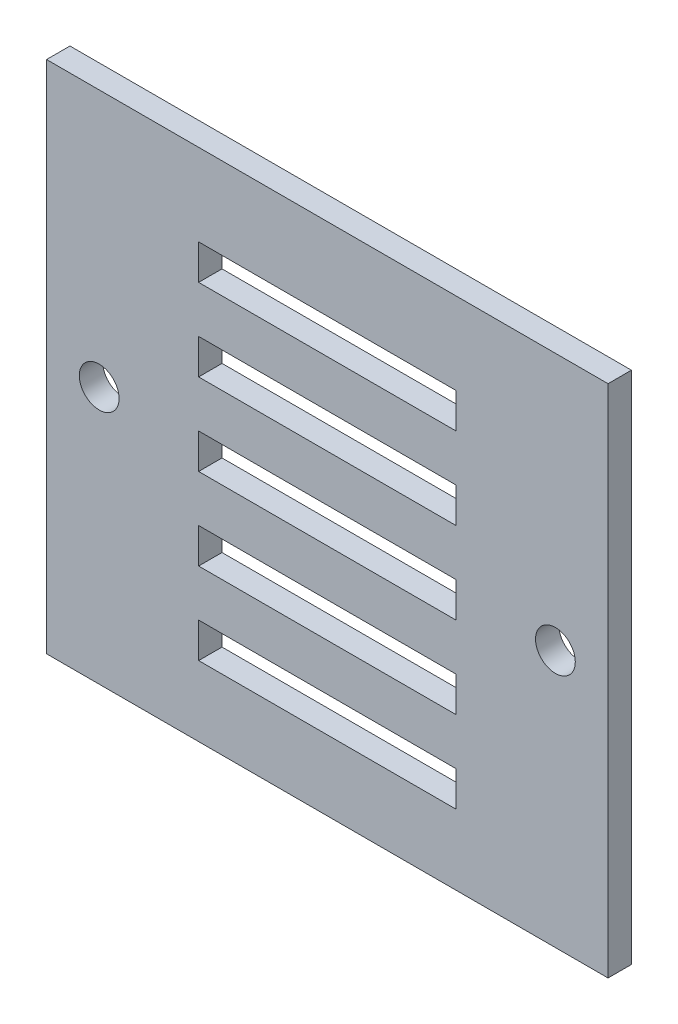
ISO-10303-21;
HEADER;
FILE_DESCRIPTION(('STEP AP214'),'2;1');
FILE_NAME('part.step','',(''),(''),'','','');
FILE_SCHEMA(('AUTOMOTIVE_DESIGN { 1 0 10303 214 1 1 1 1 }'));
ENDSEC;
DATA;
#1=APPLICATION_CONTEXT('core data for automotive mechanical design processes');
#2=APPLICATION_PROTOCOL_DEFINITION('international standard','automotive_design',2000,#1);
#3=PRODUCT_CONTEXT('',#1,'mechanical');
#4=PRODUCT('Part','Part','',(#3));
#5=PRODUCT_RELATED_PRODUCT_CATEGORY('part','',(#4));
#6=PRODUCT_DEFINITION_FORMATION('','',#4);
#7=PRODUCT_DEFINITION_CONTEXT('part definition',#1,'design');
#8=PRODUCT_DEFINITION('design','',#6,#7);
#9=PRODUCT_DEFINITION_SHAPE('','',#8);
#10=(LENGTH_UNIT() NAMED_UNIT(*) SI_UNIT(.MILLI.,.METRE.));
#11=(NAMED_UNIT(*) PLANE_ANGLE_UNIT() SI_UNIT($,.RADIAN.));
#12=(NAMED_UNIT(*) SI_UNIT($,.STERADIAN.) SOLID_ANGLE_UNIT());
#13=UNCERTAINTY_MEASURE_WITH_UNIT(LENGTH_MEASURE(1.E-05),#10,'distance_accuracy_value','');
#14=(GEOMETRIC_REPRESENTATION_CONTEXT(3) GLOBAL_UNCERTAINTY_ASSIGNED_CONTEXT((#13)) GLOBAL_UNIT_ASSIGNED_CONTEXT((#10,
#11,#12)) REPRESENTATION_CONTEXT('',''));
#15=CARTESIAN_POINT('',(0.,0.,0.));
#16=DIRECTION('',(0.,0.,1.));
#17=DIRECTION('',(1.,0.,0.));
#18=AXIS2_PLACEMENT_3D('',#15,#16,#17);
#19=CARTESIAN_POINT('',(-158.5,46.,414.9));
#20=DIRECTION('',(0.,0.,1.));
#21=DIRECTION('',(1.,0.,0.));
#22=AXIS2_PLACEMENT_3D('',#19,#20,#21);
#23=CYLINDRICAL_SURFACE('',#22,1.7);
#24=DIRECTION('',(0.,0.,1.));
#25=VECTOR('',#24,1.);
#26=CARTESIAN_POINT('',(-156.8,46.,414.9));
#27=LINE('',#26,#25);
#28=CARTESIAN_POINT('',(-156.8,46.,415.));
#29=VERTEX_POINT('',#28);
#30=CARTESIAN_POINT('',(-156.8,46.,417.));
#31=VERTEX_POINT('',#30);
#32=EDGE_CURVE('E9',#29,#31,#27,.T.);
#33=ORIENTED_EDGE('',*,*,#32,.F.);
#34=CARTESIAN_POINT('',(-158.5,46.,415.));
#35=DIRECTION('',(0.,0.,1.));
#36=DIRECTION('',(1.,0.,0.));
#37=AXIS2_PLACEMENT_3D('',#34,#35,#36);
#38=CIRCLE('',#37,1.7);
#39=EDGE_CURVE('E228',#29,#29,#38,.T.);
#40=ORIENTED_EDGE('',*,*,#39,.F.);
#41=ORIENTED_EDGE('',*,*,#32,.T.);
#42=CARTESIAN_POINT('',(-158.5,46.,417.));
#43=DIRECTION('',(0.,0.,1.));
#44=DIRECTION('',(1.,0.,0.));
#45=AXIS2_PLACEMENT_3D('',#42,#43,#44);
#46=CIRCLE('',#45,1.7);
#47=EDGE_CURVE('E290',#31,#31,#46,.T.);
#48=ORIENTED_EDGE('',*,*,#47,.T.);
#49=EDGE_LOOP('',(#33,#40,#41,#48));
#50=FACE_BOUND('',#49,.T.);
#51=ADVANCED_FACE('F14',(#50),#23,.F.);
#52=CARTESIAN_POINT('',(-189.,61.,414.9));
#53=DIRECTION('',(0.,1.,0.));
#54=DIRECTION('',(1.,0.,0.));
#55=AXIS2_PLACEMENT_3D('',#52,#53,#54);
#56=PLANE('',#55);
#57=DIRECTION('',(-1.,0.,0.));
#58=VECTOR('',#57,1.);
#59=CARTESIAN_POINT('',(-195.5,61.,417.));
#60=LINE('',#59,#58);
#61=CARTESIAN_POINT('',(-167.,61.,417.));
#62=VERTEX_POINT('',#61);
#63=CARTESIAN_POINT('',(-189.,61.,417.));
#64=VERTEX_POINT('',#63);
#65=EDGE_CURVE('E356',#62,#64,#60,.T.);
#66=ORIENTED_EDGE('',*,*,#65,.T.);
#67=DIRECTION('',(0.,0.,1.));
#68=VECTOR('',#67,1.);
#69=CARTESIAN_POINT('',(-189.,61.,414.9));
#70=LINE('',#69,#68);
#71=CARTESIAN_POINT('',(-189.,61.,415.));
#72=VERTEX_POINT('',#71);
#73=EDGE_CURVE('E25',#72,#64,#70,.T.);
#74=ORIENTED_EDGE('',*,*,#73,.F.);
#75=DIRECTION('',(-1.,0.,0.));
#76=VECTOR('',#75,1.);
#77=CARTESIAN_POINT('',(-195.5,61.,415.));
#78=LINE('',#77,#76);
#79=CARTESIAN_POINT('',(-167.,61.,415.));
#80=VERTEX_POINT('',#79);
#81=EDGE_CURVE('E234',#80,#72,#78,.T.);
#82=ORIENTED_EDGE('',*,*,#81,.F.);
#83=DIRECTION('',(0.,0.,1.));
#84=VECTOR('',#83,1.);
#85=CARTESIAN_POINT('',(-167.,61.,414.9));
#86=LINE('',#85,#84);
#87=EDGE_CURVE('E231',#80,#62,#86,.T.);
#88=ORIENTED_EDGE('',*,*,#87,.T.);
#89=EDGE_LOOP('',(#66,#74,#82,#88));
#90=FACE_BOUND('',#89,.T.);
#91=ADVANCED_FACE('F765',(#90),#56,.F.);
#92=CARTESIAN_POINT('',(-189.,58.,414.9));
#93=DIRECTION('',(1.,0.,0.));
#94=DIRECTION('',(0.,1.,0.));
#95=AXIS2_PLACEMENT_3D('',#92,#93,#94);
#96=PLANE('',#95);
#97=DIRECTION('',(0.,0.,1.));
#98=VECTOR('',#97,1.);
#99=CARTESIAN_POINT('',(-189.,58.,414.9));
#100=LINE('',#99,#98);
#101=CARTESIAN_POINT('',(-189.,58.,415.));
#102=VERTEX_POINT('',#101);
#103=CARTESIAN_POINT('',(-189.,58.,417.));
#104=VERTEX_POINT('',#103);
#105=EDGE_CURVE('E217',#102,#104,#100,.T.);
#106=ORIENTED_EDGE('',*,*,#105,.F.);
#107=DIRECTION('',(0.,1.,0.));
#108=VECTOR('',#107,1.);
#109=CARTESIAN_POINT('',(-189.,41.,415.));
#110=LINE('',#109,#108);
#111=EDGE_CURVE('E226',#102,#72,#110,.T.);
#112=ORIENTED_EDGE('',*,*,#111,.T.);
#113=ORIENTED_EDGE('',*,*,#73,.T.);
#114=DIRECTION('',(0.,1.,0.));
#115=VECTOR('',#114,1.);
#116=CARTESIAN_POINT('',(-189.,41.,417.));
#117=LINE('',#116,#115);
#118=EDGE_CURVE('E360',#104,#64,#117,.T.);
#119=ORIENTED_EDGE('',*,*,#118,.F.);
#120=EDGE_LOOP('',(#106,#112,#113,#119));
#121=FACE_BOUND('',#120,.T.);
#122=ADVANCED_FACE('F749',(#121),#96,.T.);
#123=CARTESIAN_POINT('',(-167.,58.,414.9));
#124=DIRECTION('',(1.,0.,0.));
#125=DIRECTION('',(0.,1.,0.));
#126=AXIS2_PLACEMENT_3D('',#123,#124,#125);
#127=PLANE('',#126);
#128=DIRECTION('',(0.,1.,0.));
#129=VECTOR('',#128,1.);
#130=CARTESIAN_POINT('',(-167.,41.,417.));
#131=LINE('',#130,#129);
#132=CARTESIAN_POINT('',(-167.,58.,417.));
#133=VERTEX_POINT('',#132);
#134=EDGE_CURVE('E294',#133,#62,#131,.T.);
#135=ORIENTED_EDGE('',*,*,#134,.T.);
#136=ORIENTED_EDGE('',*,*,#87,.F.);
#137=DIRECTION('',(0.,1.,0.));
#138=VECTOR('',#137,1.);
#139=CARTESIAN_POINT('',(-167.,41.,415.));
#140=LINE('',#139,#138);
#141=CARTESIAN_POINT('',(-167.,58.,415.));
#142=VERTEX_POINT('',#141);
#143=EDGE_CURVE('E224',#142,#80,#140,.T.);
#144=ORIENTED_EDGE('',*,*,#143,.F.);
#145=DIRECTION('',(0.,0.,1.));
#146=VECTOR('',#145,1.);
#147=CARTESIAN_POINT('',(-167.,58.,414.9));
#148=LINE('',#147,#146);
#149=EDGE_CURVE('E205',#142,#133,#148,.T.);
#150=ORIENTED_EDGE('',*,*,#149,.T.);
#151=EDGE_LOOP('',(#135,#136,#144,#150));
#152=FACE_BOUND('',#151,.T.);
#153=ADVANCED_FACE('F230',(#152),#127,.F.);
#154=CARTESIAN_POINT('',(-189.,58.,414.9));
#155=DIRECTION('',(0.,1.,0.));
#156=DIRECTION('',(1.,0.,0.));
#157=AXIS2_PLACEMENT_3D('',#154,#155,#156);
#158=PLANE('',#157);
#159=ORIENTED_EDGE('',*,*,#149,.F.);
#160=DIRECTION('',(-1.,0.,0.));
#161=VECTOR('',#160,1.);
#162=CARTESIAN_POINT('',(-195.5,58.,415.));
#163=LINE('',#162,#161);
#164=EDGE_CURVE('E208',#142,#102,#163,.T.);
#165=ORIENTED_EDGE('',*,*,#164,.T.);
#166=ORIENTED_EDGE('',*,*,#105,.T.);
#167=DIRECTION('',(-1.,0.,0.));
#168=VECTOR('',#167,1.);
#169=CARTESIAN_POINT('',(-195.5,58.,417.));
#170=LINE('',#169,#168);
#171=EDGE_CURVE('E211',#133,#104,#170,.T.);
#172=ORIENTED_EDGE('',*,*,#171,.F.);
#173=EDGE_LOOP('',(#159,#165,#166,#172));
#174=FACE_BOUND('',#173,.T.);
#175=ADVANCED_FACE('F207',(#174),#158,.T.);
#176=CARTESIAN_POINT('',(-189.,54.,414.9));
#177=DIRECTION('',(0.,1.,0.));
#178=DIRECTION('',(1.,0.,0.));
#179=AXIS2_PLACEMENT_3D('',#176,#177,#178);
#180=PLANE('',#179);
#181=DIRECTION('',(-1.,0.,0.));
#182=VECTOR('',#181,1.);
#183=CARTESIAN_POINT('',(-195.5,54.,417.));
#184=LINE('',#183,#182);
#185=CARTESIAN_POINT('',(-167.,54.,417.));
#186=VERTEX_POINT('',#185);
#187=CARTESIAN_POINT('',(-189.,54.,417.));
#188=VERTEX_POINT('',#187);
#189=EDGE_CURVE('E273',#186,#188,#184,.T.);
#190=ORIENTED_EDGE('',*,*,#189,.T.);
#191=DIRECTION('',(0.,0.,1.));
#192=VECTOR('',#191,1.);
#193=CARTESIAN_POINT('',(-189.,54.,414.9));
#194=LINE('',#193,#192);
#195=CARTESIAN_POINT('',(-189.,54.,415.));
#196=VERTEX_POINT('',#195);
#197=EDGE_CURVE('E218',#196,#188,#194,.T.);
#198=ORIENTED_EDGE('',*,*,#197,.F.);
#199=DIRECTION('',(-1.,0.,0.));
#200=VECTOR('',#199,1.);
#201=CARTESIAN_POINT('',(-195.5,54.,415.));
#202=LINE('',#201,#200);
#203=CARTESIAN_POINT('',(-167.,54.,415.));
#204=VERTEX_POINT('',#203);
#205=EDGE_CURVE('E257',#204,#196,#202,.T.);
#206=ORIENTED_EDGE('',*,*,#205,.F.);
#207=DIRECTION('',(0.,0.,1.));
#208=VECTOR('',#207,1.);
#209=CARTESIAN_POINT('',(-167.,54.,414.9));
#210=LINE('',#209,#208);
#211=EDGE_CURVE('E345',#204,#186,#210,.T.);
#212=ORIENTED_EDGE('',*,*,#211,.T.);
#213=EDGE_LOOP('',(#190,#198,#206,#212));
#214=FACE_BOUND('',#213,.T.);
#215=ADVANCED_FACE('F665',(#214),#180,.F.);
#216=CARTESIAN_POINT('',(-189.,51.,414.9));
#217=DIRECTION('',(1.,0.,0.));
#218=DIRECTION('',(0.,1.,0.));
#219=AXIS2_PLACEMENT_3D('',#216,#217,#218);
#220=PLANE('',#219);
#221=DIRECTION('',(0.,0.,1.));
#222=VECTOR('',#221,1.);
#223=CARTESIAN_POINT('',(-189.,51.,414.9));
#224=LINE('',#223,#222);
#225=CARTESIAN_POINT('',(-189.,51.,415.));
#226=VERTEX_POINT('',#225);
#227=CARTESIAN_POINT('',(-189.,51.,417.));
#228=VERTEX_POINT('',#227);
#229=EDGE_CURVE('E348',#226,#228,#224,.T.);
#230=ORIENTED_EDGE('',*,*,#229,.F.);
#231=DIRECTION('',(0.,1.,0.));
#232=VECTOR('',#231,1.);
#233=CARTESIAN_POINT('',(-189.,37.5,415.));
#234=LINE('',#233,#232);
#235=EDGE_CURVE('E244',#226,#196,#234,.T.);
#236=ORIENTED_EDGE('',*,*,#235,.T.);
#237=ORIENTED_EDGE('',*,*,#197,.T.);
#238=DIRECTION('',(0.,1.,0.));
#239=VECTOR('',#238,1.);
#240=CARTESIAN_POINT('',(-189.,37.5,417.));
#241=LINE('',#240,#239);
#242=EDGE_CURVE('E351',#228,#188,#241,.T.);
#243=ORIENTED_EDGE('',*,*,#242,.F.);
#244=EDGE_LOOP('',(#230,#236,#237,#243));
#245=FACE_BOUND('',#244,.T.);
#246=ADVANCED_FACE('F670',(#245),#220,.T.);
#247=CARTESIAN_POINT('',(-167.,51.,414.9));
#248=DIRECTION('',(1.,0.,0.));
#249=DIRECTION('',(0.,1.,0.));
#250=AXIS2_PLACEMENT_3D('',#247,#248,#249);
#251=PLANE('',#250);
#252=DIRECTION('',(0.,1.,0.));
#253=VECTOR('',#252,1.);
#254=CARTESIAN_POINT('',(-167.,37.5,417.));
#255=LINE('',#254,#253);
#256=CARTESIAN_POINT('',(-167.,51.,417.));
#257=VERTEX_POINT('',#256);
#258=EDGE_CURVE('E269',#257,#186,#255,.T.);
#259=ORIENTED_EDGE('',*,*,#258,.T.);
#260=ORIENTED_EDGE('',*,*,#211,.F.);
#261=DIRECTION('',(0.,1.,0.));
#262=VECTOR('',#261,1.);
#263=CARTESIAN_POINT('',(-167.,37.5,415.));
#264=LINE('',#263,#262);
#265=CARTESIAN_POINT('',(-167.,51.,415.));
#266=VERTEX_POINT('',#265);
#267=EDGE_CURVE('E319',#266,#204,#264,.T.);
#268=ORIENTED_EDGE('',*,*,#267,.F.);
#269=DIRECTION('',(0.,0.,1.));
#270=VECTOR('',#269,1.);
#271=CARTESIAN_POINT('',(-167.,51.,414.9));
#272=LINE('',#271,#270);
#273=EDGE_CURVE('E326',#266,#257,#272,.T.);
#274=ORIENTED_EDGE('',*,*,#273,.T.);
#275=EDGE_LOOP('',(#259,#260,#268,#274));
#276=FACE_BOUND('',#275,.T.);
#277=ADVANCED_FACE('F647',(#276),#251,.F.);
#278=CARTESIAN_POINT('',(-189.,51.,414.9));
#279=DIRECTION('',(0.,1.,0.));
#280=DIRECTION('',(1.,0.,0.));
#281=AXIS2_PLACEMENT_3D('',#278,#279,#280);
#282=PLANE('',#281);
#283=ORIENTED_EDGE('',*,*,#273,.F.);
#284=DIRECTION('',(-1.,0.,0.));
#285=VECTOR('',#284,1.);
#286=CARTESIAN_POINT('',(-195.5,51.,415.));
#287=LINE('',#286,#285);
#288=EDGE_CURVE('E235',#266,#226,#287,.T.);
#289=ORIENTED_EDGE('',*,*,#288,.T.);
#290=ORIENTED_EDGE('',*,*,#229,.T.);
#291=DIRECTION('',(-1.,0.,0.));
#292=VECTOR('',#291,1.);
#293=CARTESIAN_POINT('',(-195.5,51.,417.));
#294=LINE('',#293,#292);
#295=EDGE_CURVE('E355',#257,#228,#294,.T.);
#296=ORIENTED_EDGE('',*,*,#295,.F.);
#297=EDGE_LOOP('',(#283,#289,#290,#296));
#298=FACE_BOUND('',#297,.T.);
#299=ADVANCED_FACE('F641',(#298),#282,.T.);
#300=CARTESIAN_POINT('',(-189.,47.,414.9));
#301=DIRECTION('',(0.,1.,0.));
#302=DIRECTION('',(1.,0.,0.));
#303=AXIS2_PLACEMENT_3D('',#300,#301,#302);
#304=PLANE('',#303);
#305=DIRECTION('',(-1.,0.,0.));
#306=VECTOR('',#305,1.);
#307=CARTESIAN_POINT('',(-195.5,47.,417.));
#308=LINE('',#307,#306);
#309=CARTESIAN_POINT('',(-167.,47.,417.));
#310=VERTEX_POINT('',#309);
#311=CARTESIAN_POINT('',(-189.,47.,417.));
#312=VERTEX_POINT('',#311);
#313=EDGE_CURVE('E386',#310,#312,#308,.T.);
#314=ORIENTED_EDGE('',*,*,#313,.T.);
#315=DIRECTION('',(0.,0.,1.));
#316=VECTOR('',#315,1.);
#317=CARTESIAN_POINT('',(-189.,47.,414.9));
#318=LINE('',#317,#316);
#319=CARTESIAN_POINT('',(-189.,47.,415.));
#320=VERTEX_POINT('',#319);
#321=EDGE_CURVE('E265',#320,#312,#318,.T.);
#322=ORIENTED_EDGE('',*,*,#321,.F.);
#323=DIRECTION('',(-1.,0.,0.));
#324=VECTOR('',#323,1.);
#325=CARTESIAN_POINT('',(-195.5,47.,415.));
#326=LINE('',#325,#324);
#327=CARTESIAN_POINT('',(-167.,47.,415.));
#328=VERTEX_POINT('',#327);
#329=EDGE_CURVE('E313',#328,#320,#326,.T.);
#330=ORIENTED_EDGE('',*,*,#329,.F.);
#331=DIRECTION('',(0.,0.,1.));
#332=VECTOR('',#331,1.);
#333=CARTESIAN_POINT('',(-167.,47.,414.9));
#334=LINE('',#333,#332);
#335=EDGE_CURVE('E262',#328,#310,#334,.T.);
#336=ORIENTED_EDGE('',*,*,#335,.T.);
#337=EDGE_LOOP('',(#314,#322,#330,#336));
#338=FACE_BOUND('',#337,.T.);
#339=ADVANCED_FACE('F646',(#338),#304,.F.);
#340=CARTESIAN_POINT('',(-189.,44.,414.9));
#341=DIRECTION('',(1.,0.,0.));
#342=DIRECTION('',(0.,1.,0.));
#343=AXIS2_PLACEMENT_3D('',#340,#341,#342);
#344=PLANE('',#343);
#345=DIRECTION('',(0.,0.,1.));
#346=VECTOR('',#345,1.);
#347=CARTESIAN_POINT('',(-189.,44.,414.9));
#348=LINE('',#347,#346);
#349=CARTESIAN_POINT('',(-189.,44.,415.));
#350=VERTEX_POINT('',#349);
#351=CARTESIAN_POINT('',(-189.,44.,417.));
#352=VERTEX_POINT('',#351);
#353=EDGE_CURVE('E266',#350,#352,#348,.T.);
#354=ORIENTED_EDGE('',*,*,#353,.F.);
#355=DIRECTION('',(0.,1.,0.));
#356=VECTOR('',#355,1.);
#357=CARTESIAN_POINT('',(-189.,34.,415.));
#358=LINE('',#357,#356);
#359=EDGE_CURVE('E317',#350,#320,#358,.T.);
#360=ORIENTED_EDGE('',*,*,#359,.T.);
#361=ORIENTED_EDGE('',*,*,#321,.T.);
#362=DIRECTION('',(0.,1.,0.));
#363=VECTOR('',#362,1.);
#364=CARTESIAN_POINT('',(-189.,34.,417.));
#365=LINE('',#364,#363);
#366=EDGE_CURVE('E382',#352,#312,#365,.T.);
#367=ORIENTED_EDGE('',*,*,#366,.F.);
#368=EDGE_LOOP('',(#354,#360,#361,#367));
#369=FACE_BOUND('',#368,.T.);
#370=ADVANCED_FACE('F621',(#369),#344,.T.);
#371=CARTESIAN_POINT('',(-167.,44.,414.9));
#372=DIRECTION('',(1.,0.,0.));
#373=DIRECTION('',(0.,1.,0.));
#374=AXIS2_PLACEMENT_3D('',#371,#372,#373);
#375=PLANE('',#374);
#376=DIRECTION('',(0.,1.,0.));
#377=VECTOR('',#376,1.);
#378=CARTESIAN_POINT('',(-167.,34.,417.));
#379=LINE('',#378,#377);
#380=CARTESIAN_POINT('',(-167.,44.,417.));
#381=VERTEX_POINT('',#380);
#382=EDGE_CURVE('E400',#381,#310,#379,.T.);
#383=ORIENTED_EDGE('',*,*,#382,.T.);
#384=ORIENTED_EDGE('',*,*,#335,.F.);
#385=DIRECTION('',(0.,1.,0.));
#386=VECTOR('',#385,1.);
#387=CARTESIAN_POINT('',(-167.,34.,415.));
#388=LINE('',#387,#386);
#389=CARTESIAN_POINT('',(-167.,44.,415.));
#390=VERTEX_POINT('',#389);
#391=EDGE_CURVE('E318',#390,#328,#388,.T.);
#392=ORIENTED_EDGE('',*,*,#391,.F.);
#393=DIRECTION('',(0.,0.,1.));
#394=VECTOR('',#393,1.);
#395=CARTESIAN_POINT('',(-167.,44.,414.9));
#396=LINE('',#395,#394);
#397=EDGE_CURVE('E378',#390,#381,#396,.T.);
#398=ORIENTED_EDGE('',*,*,#397,.T.);
#399=EDGE_LOOP('',(#383,#384,#392,#398));
#400=FACE_BOUND('',#399,.T.);
#401=ADVANCED_FACE('F503',(#400),#375,.F.);
#402=CARTESIAN_POINT('',(-189.,44.,414.9));
#403=DIRECTION('',(0.,1.,0.));
#404=DIRECTION('',(1.,0.,0.));
#405=AXIS2_PLACEMENT_3D('',#402,#403,#404);
#406=PLANE('',#405);
#407=ORIENTED_EDGE('',*,*,#397,.F.);
#408=DIRECTION('',(-1.,0.,0.));
#409=VECTOR('',#408,1.);
#410=CARTESIAN_POINT('',(-195.5,44.,415.));
#411=LINE('',#410,#409);
#412=EDGE_CURVE('E323',#390,#350,#411,.T.);
#413=ORIENTED_EDGE('',*,*,#412,.T.);
#414=ORIENTED_EDGE('',*,*,#353,.T.);
#415=DIRECTION('',(-1.,0.,0.));
#416=VECTOR('',#415,1.);
#417=CARTESIAN_POINT('',(-195.5,44.,417.));
#418=LINE('',#417,#416);
#419=EDGE_CURVE('E305',#381,#352,#418,.T.);
#420=ORIENTED_EDGE('',*,*,#419,.F.);
#421=EDGE_LOOP('',(#407,#413,#414,#420));
#422=FACE_BOUND('',#421,.T.);
#423=ADVANCED_FACE('F582',(#422),#406,.T.);
#424=CARTESIAN_POINT('',(-197.5,46.,414.9));
#425=DIRECTION('',(0.,0.,1.));
#426=DIRECTION('',(1.,0.,0.));
#427=AXIS2_PLACEMENT_3D('',#424,#425,#426);
#428=CYLINDRICAL_SURFACE('',#427,1.7);
#429=DIRECTION('',(0.,0.,1.));
#430=VECTOR('',#429,1.);
#431=CARTESIAN_POINT('',(-195.8,46.,414.9));
#432=LINE('',#431,#430);
#433=CARTESIAN_POINT('',(-195.8,46.,415.));
#434=VERTEX_POINT('',#433);
#435=CARTESIAN_POINT('',(-195.8,46.,417.));
#436=VERTEX_POINT('',#435);
#437=EDGE_CURVE('E375',#434,#436,#432,.T.);
#438=ORIENTED_EDGE('',*,*,#437,.F.);
#439=CARTESIAN_POINT('',(-197.5,46.,415.));
#440=DIRECTION('',(0.,0.,1.));
#441=DIRECTION('',(1.,0.,0.));
#442=AXIS2_PLACEMENT_3D('',#439,#440,#441);
#443=CIRCLE('',#442,1.7);
#444=EDGE_CURVE('E395',#434,#434,#443,.T.);
#445=ORIENTED_EDGE('',*,*,#444,.F.);
#446=ORIENTED_EDGE('',*,*,#437,.T.);
#447=CARTESIAN_POINT('',(-197.5,46.,417.));
#448=DIRECTION('',(0.,0.,1.));
#449=DIRECTION('',(1.,0.,0.));
#450=AXIS2_PLACEMENT_3D('',#447,#448,#449);
#451=CIRCLE('',#450,1.7);
#452=EDGE_CURVE('E301',#436,#436,#451,.T.);
#453=ORIENTED_EDGE('',*,*,#452,.T.);
#454=EDGE_LOOP('',(#438,#445,#446,#453));
#455=FACE_BOUND('',#454,.T.);
#456=ADVANCED_FACE('F575',(#455),#428,.F.);
#457=CARTESIAN_POINT('',(-189.,40.,414.9));
#458=DIRECTION('',(0.,1.,0.));
#459=DIRECTION('',(1.,0.,0.));
#460=AXIS2_PLACEMENT_3D('',#457,#458,#459);
#461=PLANE('',#460);
#462=DIRECTION('',(-1.,0.,0.));
#463=VECTOR('',#462,1.);
#464=CARTESIAN_POINT('',(-195.5,40.,417.));
#465=LINE('',#464,#463);
#466=CARTESIAN_POINT('',(-167.,40.,417.));
#467=VERTEX_POINT('',#466);
#468=CARTESIAN_POINT('',(-189.,40.,417.));
#469=VERTEX_POINT('',#468);
#470=EDGE_CURVE('E364',#467,#469,#465,.T.);
#471=ORIENTED_EDGE('',*,*,#470,.T.);
#472=DIRECTION('',(0.,0.,1.));
#473=VECTOR('',#472,1.);
#474=CARTESIAN_POINT('',(-189.,40.,414.9));
#475=LINE('',#474,#473);
#476=CARTESIAN_POINT('',(-189.,40.,415.));
#477=VERTEX_POINT('',#476);
#478=EDGE_CURVE('E252',#477,#469,#475,.T.);
#479=ORIENTED_EDGE('',*,*,#478,.F.);
#480=DIRECTION('',(-1.,0.,0.));
#481=VECTOR('',#480,1.);
#482=CARTESIAN_POINT('',(-195.5,40.,415.));
#483=LINE('',#482,#481);
#484=CARTESIAN_POINT('',(-167.,40.,415.));
#485=VERTEX_POINT('',#484);
#486=EDGE_CURVE('E438',#485,#477,#483,.T.);
#487=ORIENTED_EDGE('',*,*,#486,.F.);
#488=DIRECTION('',(0.,0.,1.));
#489=VECTOR('',#488,1.);
#490=CARTESIAN_POINT('',(-167.,40.,414.9));
#491=LINE('',#490,#489);
#492=EDGE_CURVE('E250',#485,#467,#491,.T.);
#493=ORIENTED_EDGE('',*,*,#492,.T.);
#494=EDGE_LOOP('',(#471,#479,#487,#493));
#495=FACE_BOUND('',#494,.T.);
#496=ADVANCED_FACE('F581',(#495),#461,.F.);
#497=CARTESIAN_POINT('',(-189.,37.,414.9));
#498=DIRECTION('',(1.,0.,0.));
#499=DIRECTION('',(0.,1.,0.));
#500=AXIS2_PLACEMENT_3D('',#497,#498,#499);
#501=PLANE('',#500);
#502=DIRECTION('',(0.,0.,1.));
#503=VECTOR('',#502,1.);
#504=CARTESIAN_POINT('',(-189.,37.,414.9));
#505=LINE('',#504,#503);
#506=CARTESIAN_POINT('',(-189.,37.,415.));
#507=VERTEX_POINT('',#506);
#508=CARTESIAN_POINT('',(-189.,37.,417.));
#509=VERTEX_POINT('',#508);
#510=EDGE_CURVE('E253',#507,#509,#505,.T.);
#511=ORIENTED_EDGE('',*,*,#510,.F.);
#512=DIRECTION('',(0.,1.,0.));
#513=VECTOR('',#512,1.);
#514=CARTESIAN_POINT('',(-189.,30.5,415.));
#515=LINE('',#514,#513);
#516=EDGE_CURVE('E396',#507,#477,#515,.T.);
#517=ORIENTED_EDGE('',*,*,#516,.T.);
#518=ORIENTED_EDGE('',*,*,#478,.T.);
#519=DIRECTION('',(0.,1.,0.));
#520=VECTOR('',#519,1.);
#521=CARTESIAN_POINT('',(-189.,30.5,417.));
#522=LINE('',#521,#520);
#523=EDGE_CURVE('E343',#509,#469,#522,.T.);
#524=ORIENTED_EDGE('',*,*,#523,.F.);
#525=EDGE_LOOP('',(#511,#517,#518,#524));
#526=FACE_BOUND('',#525,.T.);
#527=ADVANCED_FACE('F605',(#526),#501,.T.);
#528=CARTESIAN_POINT('',(-167.,37.,414.9));
#529=DIRECTION('',(1.,0.,0.));
#530=DIRECTION('',(0.,1.,0.));
#531=AXIS2_PLACEMENT_3D('',#528,#529,#530);
#532=PLANE('',#531);
#533=DIRECTION('',(0.,1.,0.));
#534=VECTOR('',#533,1.);
#535=CARTESIAN_POINT('',(-167.,30.5,417.));
#536=LINE('',#535,#534);
#537=CARTESIAN_POINT('',(-167.,37.,417.));
#538=VERTEX_POINT('',#537);
#539=EDGE_CURVE('E306',#538,#467,#536,.T.);
#540=ORIENTED_EDGE('',*,*,#539,.T.);
#541=ORIENTED_EDGE('',*,*,#492,.F.);
#542=DIRECTION('',(0.,1.,0.));
#543=VECTOR('',#542,1.);
#544=CARTESIAN_POINT('',(-167.,30.5,415.));
#545=LINE('',#544,#543);
#546=CARTESIAN_POINT('',(-167.,37.,415.));
#547=VERTEX_POINT('',#546);
#548=EDGE_CURVE('E299',#547,#485,#545,.T.);
#549=ORIENTED_EDGE('',*,*,#548,.F.);
#550=DIRECTION('',(0.,0.,1.));
#551=VECTOR('',#550,1.);
#552=CARTESIAN_POINT('',(-167.,37.,414.9));
#553=LINE('',#552,#551);
#554=EDGE_CURVE('E387',#547,#538,#553,.T.);
#555=ORIENTED_EDGE('',*,*,#554,.T.);
#556=EDGE_LOOP('',(#540,#541,#549,#555));
#557=FACE_BOUND('',#556,.T.);
#558=ADVANCED_FACE('F16',(#557),#532,.F.);
#559=CARTESIAN_POINT('',(-189.,37.,414.9));
#560=DIRECTION('',(0.,1.,0.));
#561=DIRECTION('',(1.,0.,0.));
#562=AXIS2_PLACEMENT_3D('',#559,#560,#561);
#563=PLANE('',#562);
#564=ORIENTED_EDGE('',*,*,#554,.F.);
#565=DIRECTION('',(-1.,0.,0.));
#566=VECTOR('',#565,1.);
#567=CARTESIAN_POINT('',(-195.5,37.,415.));
#568=LINE('',#567,#566);
#569=EDGE_CURVE('E391',#547,#507,#568,.T.);
#570=ORIENTED_EDGE('',*,*,#569,.T.);
#571=ORIENTED_EDGE('',*,*,#510,.T.);
#572=DIRECTION('',(-1.,0.,0.));
#573=VECTOR('',#572,1.);
#574=CARTESIAN_POINT('',(-195.5,37.,417.));
#575=LINE('',#574,#573);
#576=EDGE_CURVE('E339',#538,#509,#575,.T.);
#577=ORIENTED_EDGE('',*,*,#576,.F.);
#578=EDGE_LOOP('',(#564,#570,#571,#577));
#579=FACE_BOUND('',#578,.T.);
#580=ADVANCED_FACE('F597',(#579),#563,.T.);
#581=CARTESIAN_POINT('',(-189.,33.,414.9));
#582=DIRECTION('',(0.,1.,0.));
#583=DIRECTION('',(1.,0.,0.));
#584=AXIS2_PLACEMENT_3D('',#581,#582,#583);
#585=PLANE('',#584);
#586=DIRECTION('',(-1.,0.,0.));
#587=VECTOR('',#586,1.);
#588=CARTESIAN_POINT('',(-195.5,33.,417.));
#589=LINE('',#588,#587);
#590=CARTESIAN_POINT('',(-167.,33.,417.));
#591=VERTEX_POINT('',#590);
#592=CARTESIAN_POINT('',(-189.,33.,417.));
#593=VERTEX_POINT('',#592);
#594=EDGE_CURVE('E332',#591,#593,#589,.T.);
#595=ORIENTED_EDGE('',*,*,#594,.T.);
#596=DIRECTION('',(0.,0.,1.));
#597=VECTOR('',#596,1.);
#598=CARTESIAN_POINT('',(-189.,33.,414.9));
#599=LINE('',#598,#597);
#600=CARTESIAN_POINT('',(-189.,33.,415.));
#601=VERTEX_POINT('',#600);
#602=EDGE_CURVE('E390',#601,#593,#599,.T.);
#603=ORIENTED_EDGE('',*,*,#602,.F.);
#604=DIRECTION('',(-1.,0.,0.));
#605=VECTOR('',#604,1.);
#606=CARTESIAN_POINT('',(-195.5,33.,415.));
#607=LINE('',#606,#605);
#608=CARTESIAN_POINT('',(-167.,33.,415.));
#609=VERTEX_POINT('',#608);
#610=EDGE_CURVE('E288',#609,#601,#607,.T.);
#611=ORIENTED_EDGE('',*,*,#610,.F.);
#612=DIRECTION('',(0.,0.,1.));
#613=VECTOR('',#612,1.);
#614=CARTESIAN_POINT('',(-167.,33.,414.9));
#615=LINE('',#614,#613);
#616=EDGE_CURVE('E248',#609,#591,#615,.T.);
#617=ORIENTED_EDGE('',*,*,#616,.T.);
#618=EDGE_LOOP('',(#595,#603,#611,#617));
#619=FACE_BOUND('',#618,.T.);
#620=ADVANCED_FACE('F523',(#619),#585,.F.);
#621=CARTESIAN_POINT('',(-189.,30.,414.9));
#622=DIRECTION('',(1.,0.,0.));
#623=DIRECTION('',(0.,1.,0.));
#624=AXIS2_PLACEMENT_3D('',#621,#622,#623);
#625=PLANE('',#624);
#626=DIRECTION('',(0.,0.,1.));
#627=VECTOR('',#626,1.);
#628=CARTESIAN_POINT('',(-189.,30.,414.9));
#629=LINE('',#628,#627);
#630=CARTESIAN_POINT('',(-189.,30.,415.));
#631=VERTEX_POINT('',#630);
#632=CARTESIAN_POINT('',(-189.,30.,417.));
#633=VERTEX_POINT('',#632);
#634=EDGE_CURVE('E258',#631,#633,#629,.T.);
#635=ORIENTED_EDGE('',*,*,#634,.F.);
#636=DIRECTION('',(0.,1.,0.));
#637=VECTOR('',#636,1.);
#638=CARTESIAN_POINT('',(-189.,27.,415.));
#639=LINE('',#638,#637);
#640=EDGE_CURVE('E300',#631,#601,#639,.T.);
#641=ORIENTED_EDGE('',*,*,#640,.T.);
#642=ORIENTED_EDGE('',*,*,#602,.T.);
#643=DIRECTION('',(0.,1.,0.));
#644=VECTOR('',#643,1.);
#645=CARTESIAN_POINT('',(-189.,27.,417.));
#646=LINE('',#645,#644);
#647=EDGE_CURVE('E311',#633,#593,#646,.T.);
#648=ORIENTED_EDGE('',*,*,#647,.F.);
#649=EDGE_LOOP('',(#635,#641,#642,#648));
#650=FACE_BOUND('',#649,.T.);
#651=ADVANCED_FACE('F528',(#650),#625,.T.);
#652=CARTESIAN_POINT('',(-167.,30.,414.9));
#653=DIRECTION('',(1.,0.,0.));
#654=DIRECTION('',(0.,1.,0.));
#655=AXIS2_PLACEMENT_3D('',#652,#653,#654);
#656=PLANE('',#655);
#657=DIRECTION('',(0.,1.,0.));
#658=VECTOR('',#657,1.);
#659=CARTESIAN_POINT('',(-167.,27.,417.));
#660=LINE('',#659,#658);
#661=CARTESIAN_POINT('',(-167.,30.,417.));
#662=VERTEX_POINT('',#661);
#663=EDGE_CURVE('E344',#662,#591,#660,.T.);
#664=ORIENTED_EDGE('',*,*,#663,.T.);
#665=ORIENTED_EDGE('',*,*,#616,.F.);
#666=DIRECTION('',(0.,1.,0.));
#667=VECTOR('',#666,1.);
#668=CARTESIAN_POINT('',(-167.,27.,415.));
#669=LINE('',#668,#667);
#670=CARTESIAN_POINT('',(-167.,30.,415.));
#671=VERTEX_POINT('',#670);
#672=EDGE_CURVE('E284',#671,#609,#669,.T.);
#673=ORIENTED_EDGE('',*,*,#672,.F.);
#674=DIRECTION('',(0.,0.,1.));
#675=VECTOR('',#674,1.);
#676=CARTESIAN_POINT('',(-167.,30.,414.9));
#677=LINE('',#676,#675);
#678=EDGE_CURVE('E261',#671,#662,#677,.T.);
#679=ORIENTED_EDGE('',*,*,#678,.T.);
#680=EDGE_LOOP('',(#664,#665,#673,#679));
#681=FACE_BOUND('',#680,.T.);
#682=ADVANCED_FACE('F534',(#681),#656,.F.);
#683=CARTESIAN_POINT('',(-189.,30.,414.9));
#684=DIRECTION('',(0.,1.,0.));
#685=DIRECTION('',(1.,0.,0.));
#686=AXIS2_PLACEMENT_3D('',#683,#684,#685);
#687=PLANE('',#686);
#688=ORIENTED_EDGE('',*,*,#678,.F.);
#689=DIRECTION('',(-1.,0.,0.));
#690=VECTOR('',#689,1.);
#691=CARTESIAN_POINT('',(-195.5,30.,415.));
#692=LINE('',#691,#690);
#693=EDGE_CURVE('E295',#671,#631,#692,.T.);
#694=ORIENTED_EDGE('',*,*,#693,.T.);
#695=ORIENTED_EDGE('',*,*,#634,.T.);
#696=DIRECTION('',(-1.,0.,0.));
#697=VECTOR('',#696,1.);
#698=CARTESIAN_POINT('',(-195.5,30.,417.));
#699=LINE('',#698,#697);
#700=EDGE_CURVE('E307',#662,#633,#699,.T.);
#701=ORIENTED_EDGE('',*,*,#700,.F.);
#702=EDGE_LOOP('',(#688,#694,#695,#701));
#703=FACE_BOUND('',#702,.T.);
#704=ADVANCED_FACE('F736',(#703),#687,.T.);
#705=CARTESIAN_POINT('',(-154.,24.,415.));
#706=DIRECTION('',(1.,0.,0.));
#707=DIRECTION('',(0.,1.,0.));
#708=AXIS2_PLACEMENT_3D('',#705,#706,#707);
#709=PLANE('',#708);
#710=DIRECTION('',(0.,0.,1.));
#711=VECTOR('',#710,1.);
#712=CARTESIAN_POINT('',(-154.,24.,415.));
#713=LINE('',#712,#711);
#714=CARTESIAN_POINT('',(-154.,24.,415.));
#715=VERTEX_POINT('',#714);
#716=CARTESIAN_POINT('',(-154.,24.,417.));
#717=VERTEX_POINT('',#716);
#718=EDGE_CURVE('E282',#715,#717,#713,.T.);
#719=ORIENTED_EDGE('',*,*,#718,.F.);
#720=DIRECTION('',(0.,1.,0.));
#721=VECTOR('',#720,1.);
#722=CARTESIAN_POINT('',(-154.,24.,415.));
#723=LINE('',#722,#721);
#724=CARTESIAN_POINT('',(-154.,68.,415.));
#725=VERTEX_POINT('',#724);
#726=EDGE_CURVE('E289',#715,#725,#723,.T.);
#727=ORIENTED_EDGE('',*,*,#726,.T.);
#728=DIRECTION('',(0.,0.,1.));
#729=VECTOR('',#728,1.);
#730=CARTESIAN_POINT('',(-154.,68.,415.));
#731=LINE('',#730,#729);
#732=CARTESIAN_POINT('',(-154.,68.,417.));
#733=VERTEX_POINT('',#732);
#734=EDGE_CURVE('E327',#725,#733,#731,.T.);
#735=ORIENTED_EDGE('',*,*,#734,.T.);
#736=DIRECTION('',(0.,1.,0.));
#737=VECTOR('',#736,1.);
#738=CARTESIAN_POINT('',(-154.,24.,417.));
#739=LINE('',#738,#737);
#740=EDGE_CURVE('E18',#717,#733,#739,.T.);
#741=ORIENTED_EDGE('',*,*,#740,.F.);
#742=EDGE_LOOP('',(#719,#727,#735,#741));
#743=FACE_BOUND('',#742,.T.);
#744=ADVANCED_FACE('F632',(#743),#709,.T.);
#745=CARTESIAN_POINT('',(-202.,24.,415.));
#746=DIRECTION('',(0.,0.,1.));
#747=DIRECTION('',(1.,0.,0.));
#748=AXIS2_PLACEMENT_3D('',#745,#746,#747);
#749=PLANE('',#748);
#750=ORIENTED_EDGE('',*,*,#39,.T.);
#751=EDGE_LOOP('',(#750));
#752=FACE_BOUND('',#751,.T.);
#753=ORIENTED_EDGE('',*,*,#143,.T.);
#754=ORIENTED_EDGE('',*,*,#81,.T.);
#755=ORIENTED_EDGE('',*,*,#111,.F.);
#756=ORIENTED_EDGE('',*,*,#164,.F.);
#757=EDGE_LOOP('',(#753,#754,#755,#756));
#758=FACE_BOUND('',#757,.T.);
#759=ORIENTED_EDGE('',*,*,#267,.T.);
#760=ORIENTED_EDGE('',*,*,#205,.T.);
#761=ORIENTED_EDGE('',*,*,#235,.F.);
#762=ORIENTED_EDGE('',*,*,#288,.F.);
#763=EDGE_LOOP('',(#759,#760,#761,#762));
#764=FACE_BOUND('',#763,.T.);
#765=ORIENTED_EDGE('',*,*,#391,.T.);
#766=ORIENTED_EDGE('',*,*,#329,.T.);
#767=ORIENTED_EDGE('',*,*,#359,.F.);
#768=ORIENTED_EDGE('',*,*,#412,.F.);
#769=EDGE_LOOP('',(#765,#766,#767,#768));
#770=FACE_BOUND('',#769,.T.);
#771=ORIENTED_EDGE('',*,*,#444,.T.);
#772=EDGE_LOOP('',(#771));
#773=FACE_BOUND('',#772,.T.);
#774=ORIENTED_EDGE('',*,*,#548,.T.);
#775=ORIENTED_EDGE('',*,*,#486,.T.);
#776=ORIENTED_EDGE('',*,*,#516,.F.);
#777=ORIENTED_EDGE('',*,*,#569,.F.);
#778=EDGE_LOOP('',(#774,#775,#776,#777));
#779=FACE_BOUND('',#778,.T.);
#780=ORIENTED_EDGE('',*,*,#672,.T.);
#781=ORIENTED_EDGE('',*,*,#610,.T.);
#782=ORIENTED_EDGE('',*,*,#640,.F.);
#783=ORIENTED_EDGE('',*,*,#693,.F.);
#784=EDGE_LOOP('',(#780,#781,#782,#783));
#785=FACE_BOUND('',#784,.T.);
#786=DIRECTION('',(1.,0.,0.));
#787=VECTOR('',#786,1.);
#788=CARTESIAN_POINT('',(-202.,68.,415.));
#789=LINE('',#788,#787);
#790=CARTESIAN_POINT('',(-202.,68.,415.));
#791=VERTEX_POINT('',#790);
#792=EDGE_CURVE('E293',#791,#725,#789,.T.);
#793=ORIENTED_EDGE('',*,*,#792,.T.);
#794=ORIENTED_EDGE('',*,*,#726,.F.);
#795=DIRECTION('',(1.,0.,0.));
#796=VECTOR('',#795,1.);
#797=CARTESIAN_POINT('',(-202.,24.,415.));
#798=LINE('',#797,#796);
#799=CARTESIAN_POINT('',(-202.,24.,415.));
#800=VERTEX_POINT('',#799);
#801=EDGE_CURVE('E370',#800,#715,#798,.T.);
#802=ORIENTED_EDGE('',*,*,#801,.F.);
#803=DIRECTION('',(0.,1.,0.));
#804=VECTOR('',#803,1.);
#805=CARTESIAN_POINT('',(-202.,24.,415.));
#806=LINE('',#805,#804);
#807=EDGE_CURVE('E283',#800,#791,#806,.T.);
#808=ORIENTED_EDGE('',*,*,#807,.T.);
#809=EDGE_LOOP('',(#793,#794,#802,#808));
#810=FACE_BOUND('',#809,.T.);
#811=ADVANCED_FACE('F221',(#752,#758,#764,#770,#773,#779,#785,#810),#749,.F.);
#812=CARTESIAN_POINT('',(-202.,68.,415.));
#813=DIRECTION('',(0.,1.,0.));
#814=DIRECTION('',(1.,0.,0.));
#815=AXIS2_PLACEMENT_3D('',#812,#813,#814);
#816=PLANE('',#815);
#817=ORIENTED_EDGE('',*,*,#792,.F.);
#818=DIRECTION('',(0.,0.,1.));
#819=VECTOR('',#818,1.);
#820=CARTESIAN_POINT('',(-202.,68.,415.));
#821=LINE('',#820,#819);
#822=CARTESIAN_POINT('',(-202.,68.,417.));
#823=VERTEX_POINT('',#822);
#824=EDGE_CURVE('E338',#791,#823,#821,.T.);
#825=ORIENTED_EDGE('',*,*,#824,.T.);
#826=DIRECTION('',(1.,0.,0.));
#827=VECTOR('',#826,1.);
#828=CARTESIAN_POINT('',(-202.,68.,417.));
#829=LINE('',#828,#827);
#830=EDGE_CURVE('E312',#823,#733,#829,.T.);
#831=ORIENTED_EDGE('',*,*,#830,.T.);
#832=ORIENTED_EDGE('',*,*,#734,.F.);
#833=EDGE_LOOP('',(#817,#825,#831,#832));
#834=FACE_BOUND('',#833,.T.);
#835=ADVANCED_FACE('F556',(#834),#816,.T.);
#836=CARTESIAN_POINT('',(-202.,24.,417.));
#837=DIRECTION('',(0.,0.,1.));
#838=DIRECTION('',(1.,0.,0.));
#839=AXIS2_PLACEMENT_3D('',#836,#837,#838);
#840=PLANE('',#839);
#841=ORIENTED_EDGE('',*,*,#47,.F.);
#842=EDGE_LOOP('',(#841));
#843=FACE_BOUND('',#842,.T.);
#844=ORIENTED_EDGE('',*,*,#171,.T.);
#845=ORIENTED_EDGE('',*,*,#118,.T.);
#846=ORIENTED_EDGE('',*,*,#65,.F.);
#847=ORIENTED_EDGE('',*,*,#134,.F.);
#848=EDGE_LOOP('',(#844,#845,#846,#847));
#849=FACE_BOUND('',#848,.T.);
#850=ORIENTED_EDGE('',*,*,#295,.T.);
#851=ORIENTED_EDGE('',*,*,#242,.T.);
#852=ORIENTED_EDGE('',*,*,#189,.F.);
#853=ORIENTED_EDGE('',*,*,#258,.F.);
#854=EDGE_LOOP('',(#850,#851,#852,#853));
#855=FACE_BOUND('',#854,.T.);
#856=ORIENTED_EDGE('',*,*,#419,.T.);
#857=ORIENTED_EDGE('',*,*,#366,.T.);
#858=ORIENTED_EDGE('',*,*,#313,.F.);
#859=ORIENTED_EDGE('',*,*,#382,.F.);
#860=EDGE_LOOP('',(#856,#857,#858,#859));
#861=FACE_BOUND('',#860,.T.);
#862=ORIENTED_EDGE('',*,*,#452,.F.);
#863=EDGE_LOOP('',(#862));
#864=FACE_BOUND('',#863,.T.);
#865=ORIENTED_EDGE('',*,*,#576,.T.);
#866=ORIENTED_EDGE('',*,*,#523,.T.);
#867=ORIENTED_EDGE('',*,*,#470,.F.);
#868=ORIENTED_EDGE('',*,*,#539,.F.);
#869=EDGE_LOOP('',(#865,#866,#867,#868));
#870=FACE_BOUND('',#869,.T.);
#871=ORIENTED_EDGE('',*,*,#700,.T.);
#872=ORIENTED_EDGE('',*,*,#647,.T.);
#873=ORIENTED_EDGE('',*,*,#594,.F.);
#874=ORIENTED_EDGE('',*,*,#663,.F.);
#875=EDGE_LOOP('',(#871,#872,#873,#874));
#876=FACE_BOUND('',#875,.T.);
#877=DIRECTION('',(0.,1.,0.));
#878=VECTOR('',#877,1.);
#879=CARTESIAN_POINT('',(-202.,24.,417.));
#880=LINE('',#879,#878);
#881=CARTESIAN_POINT('',(-202.,24.,417.));
#882=VERTEX_POINT('',#881);
#883=EDGE_CURVE('E334',#882,#823,#880,.T.);
#884=ORIENTED_EDGE('',*,*,#883,.F.);
#885=DIRECTION('',(1.,0.,0.));
#886=VECTOR('',#885,1.);
#887=CARTESIAN_POINT('',(-202.,24.,417.));
#888=LINE('',#887,#886);
#889=EDGE_CURVE('E374',#882,#717,#888,.T.);
#890=ORIENTED_EDGE('',*,*,#889,.T.);
#891=ORIENTED_EDGE('',*,*,#740,.T.);
#892=ORIENTED_EDGE('',*,*,#830,.F.);
#893=EDGE_LOOP('',(#884,#890,#891,#892));
#894=FACE_BOUND('',#893,.T.);
#895=ADVANCED_FACE('F565',(#843,#849,#855,#861,#864,#870,#876,#894),#840,.T.);
#896=CARTESIAN_POINT('',(-202.,24.,415.));
#897=DIRECTION('',(0.,1.,0.));
#898=DIRECTION('',(1.,0.,0.));
#899=AXIS2_PLACEMENT_3D('',#896,#897,#898);
#900=PLANE('',#899);
#901=ORIENTED_EDGE('',*,*,#718,.T.);
#902=ORIENTED_EDGE('',*,*,#889,.F.);
#903=DIRECTION('',(0.,0.,1.));
#904=VECTOR('',#903,1.);
#905=CARTESIAN_POINT('',(-202.,24.,415.));
#906=LINE('',#905,#904);
#907=EDGE_CURVE('E278',#800,#882,#906,.T.);
#908=ORIENTED_EDGE('',*,*,#907,.F.);
#909=ORIENTED_EDGE('',*,*,#801,.T.);
#910=EDGE_LOOP('',(#901,#902,#908,#909));
#911=FACE_BOUND('',#910,.T.);
#912=ADVANCED_FACE('F710',(#911),#900,.F.);
#913=CARTESIAN_POINT('',(-202.,24.,415.));
#914=DIRECTION('',(1.,0.,0.));
#915=DIRECTION('',(0.,1.,0.));
#916=AXIS2_PLACEMENT_3D('',#913,#914,#915);
#917=PLANE('',#916);
#918=ORIENTED_EDGE('',*,*,#883,.T.);
#919=ORIENTED_EDGE('',*,*,#824,.F.);
#920=ORIENTED_EDGE('',*,*,#807,.F.);
#921=ORIENTED_EDGE('',*,*,#907,.T.);
#922=EDGE_LOOP('',(#918,#919,#920,#921));
#923=FACE_BOUND('',#922,.T.);
#924=ADVANCED_FACE('F562',(#923),#917,.F.);
#925=CLOSED_SHELL('',(#51,#91,#122,#153,#175,#215,#246,#277,#299,#339,#370,#401,#423,#456,#496,
#527,#558,#580,#620,#651,#682,#704,#744,#811,#835,#895,#912,#924));
#926=MANIFOLD_SOLID_BREP('B1',#925);
#927=ADVANCED_BREP_SHAPE_REPRESENTATION('',(#18,#926),#14);
#928=SHAPE_DEFINITION_REPRESENTATION(#9,#927);
ENDSEC;
END-ISO-10303-21;
